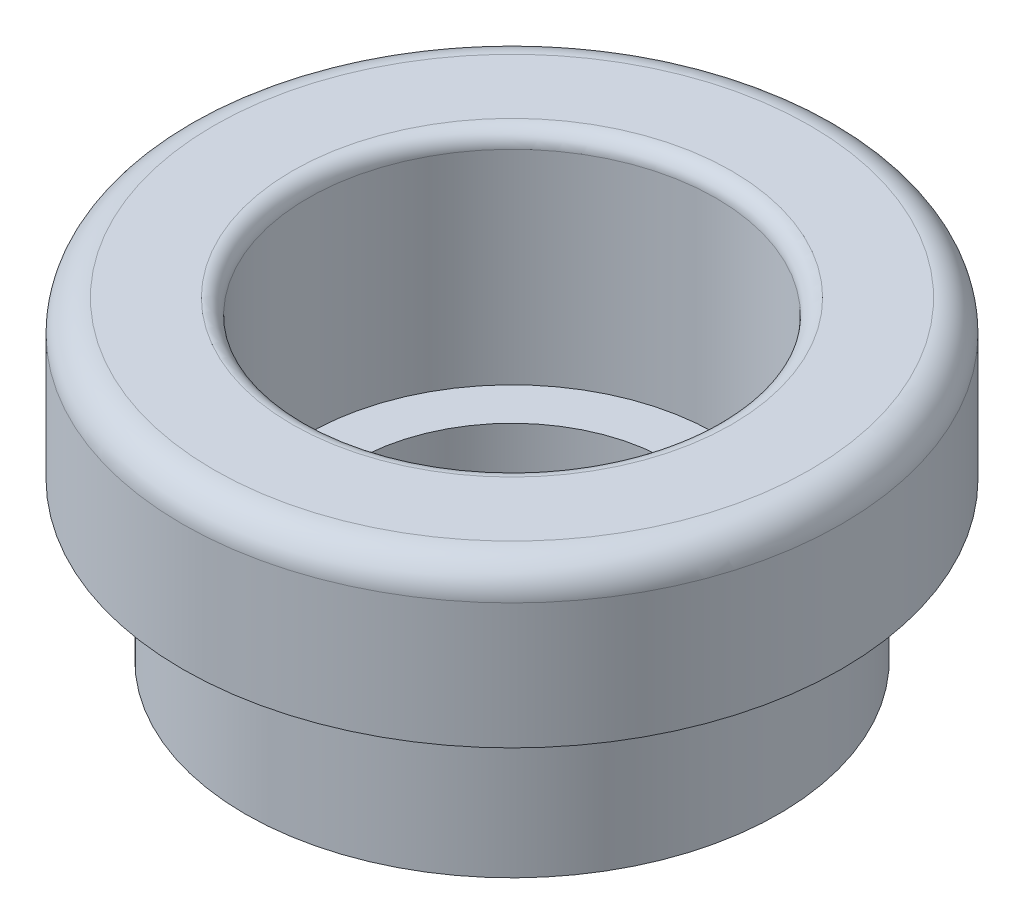
ISO-10303-21;
HEADER;
FILE_DESCRIPTION(('STEP AP214'),'2;1');
FILE_NAME('part.step','',(''),(''),'','','');
FILE_SCHEMA(('AUTOMOTIVE_DESIGN { 1 0 10303 214 1 1 1 1 }'));
ENDSEC;
DATA;
#1=APPLICATION_CONTEXT('core data for automotive mechanical design processes');
#2=APPLICATION_PROTOCOL_DEFINITION('international standard','automotive_design',2000,#1);
#3=PRODUCT_CONTEXT('',#1,'mechanical');
#4=PRODUCT('Part','Part','',(#3));
#5=PRODUCT_RELATED_PRODUCT_CATEGORY('part','',(#4));
#6=PRODUCT_DEFINITION_FORMATION('','',#4);
#7=PRODUCT_DEFINITION_CONTEXT('part definition',#1,'design');
#8=PRODUCT_DEFINITION('design','',#6,#7);
#9=PRODUCT_DEFINITION_SHAPE('','',#8);
#10=(LENGTH_UNIT() NAMED_UNIT(*) SI_UNIT(.MILLI.,.METRE.));
#11=(NAMED_UNIT(*) PLANE_ANGLE_UNIT() SI_UNIT($,.RADIAN.));
#12=(NAMED_UNIT(*) SI_UNIT($,.STERADIAN.) SOLID_ANGLE_UNIT());
#13=UNCERTAINTY_MEASURE_WITH_UNIT(LENGTH_MEASURE(1.E-05),#10,'distance_accuracy_value','');
#14=(GEOMETRIC_REPRESENTATION_CONTEXT(3) GLOBAL_UNCERTAINTY_ASSIGNED_CONTEXT((#13)) GLOBAL_UNIT_ASSIGNED_CONTEXT((#10,
#11,#12)) REPRESENTATION_CONTEXT('',''));
#15=CARTESIAN_POINT('',(0.,0.,0.));
#16=DIRECTION('',(0.,0.,1.));
#17=DIRECTION('',(1.,0.,0.));
#18=AXIS2_PLACEMENT_3D('',#15,#16,#17);
#19=CARTESIAN_POINT('',(0.,0.,0.));
#20=DIRECTION('',(0.,1.,0.));
#21=DIRECTION('',(0.,0.,1.));
#22=AXIS2_PLACEMENT_3D('',#19,#20,#21);
#23=CYLINDRICAL_SURFACE('',#22,5.);
#24=CARTESIAN_POINT('',(0.,0.,0.));
#25=DIRECTION('',(0.,1.,0.));
#26=DIRECTION('',(0.,0.,1.));
#27=AXIS2_PLACEMENT_3D('',#24,#25,#26);
#28=CIRCLE('',#27,5.);
#29=CARTESIAN_POINT('',(0.,0.,5.));
#30=VERTEX_POINT('',#29);
#31=EDGE_CURVE('E63',#30,#30,#28,.T.);
#32=ORIENTED_EDGE('',*,*,#31,.F.);
#33=EDGE_LOOP('',(#32));
#34=FACE_BOUND('',#33,.T.);
#35=CARTESIAN_POINT('',(0.,3.,0.));
#36=DIRECTION('',(0.,1.,0.));
#37=DIRECTION('',(0.,0.,1.));
#38=AXIS2_PLACEMENT_3D('',#35,#36,#37);
#39=CIRCLE('',#38,5.);
#40=CARTESIAN_POINT('',(0.,3.,5.));
#41=VERTEX_POINT('',#40);
#42=EDGE_CURVE('E60',#41,#41,#39,.F.);
#43=ORIENTED_EDGE('',*,*,#42,.F.);
#44=EDGE_LOOP('',(#43));
#45=FACE_BOUND('',#44,.T.);
#46=ADVANCED_FACE('F39',(#34,#45),#23,.F.);
#47=CARTESIAN_POINT('',(0.,5.,0.));
#48=DIRECTION('',(0.,-1.,0.));
#49=DIRECTION('',(0.,0.,-1.));
#50=AXIS2_PLACEMENT_3D('',#47,#48,#49);
#51=CYLINDRICAL_SURFACE('',#50,8.5);
#52=CARTESIAN_POINT('',(0.,5.,0.));
#53=DIRECTION('',(0.,1.,0.));
#54=DIRECTION('',(0.,0.,1.));
#55=AXIS2_PLACEMENT_3D('',#52,#53,#54);
#56=CIRCLE('',#55,8.5);
#57=CARTESIAN_POINT('',(0.,5.,8.5));
#58=VERTEX_POINT('',#57);
#59=EDGE_CURVE('E59',#58,#58,#56,.T.);
#60=ORIENTED_EDGE('',*,*,#59,.F.);
#61=EDGE_LOOP('',(#60));
#62=FACE_BOUND('',#61,.T.);
#63=CARTESIAN_POINT('',(0.,0.,0.));
#64=DIRECTION('',(0.,1.,0.));
#65=DIRECTION('',(0.,0.,1.));
#66=AXIS2_PLACEMENT_3D('',#63,#64,#65);
#67=CIRCLE('',#66,8.5);
#68=CARTESIAN_POINT('',(0.,0.,8.5));
#69=VERTEX_POINT('',#68);
#70=EDGE_CURVE('E65',#69,#69,#67,.T.);
#71=ORIENTED_EDGE('',*,*,#70,.T.);
#72=EDGE_LOOP('',(#71));
#73=FACE_BOUND('',#72,.T.);
#74=ADVANCED_FACE('F96',(#62,#73),#51,.T.);
#75=CARTESIAN_POINT('',(0.,0.,0.));
#76=DIRECTION('',(0.,1.,0.));
#77=DIRECTION('',(0.,0.,1.));
#78=AXIS2_PLACEMENT_3D('',#75,#76,#77);
#79=PLANE('',#78);
#80=ORIENTED_EDGE('',*,*,#31,.T.);
#81=EDGE_LOOP('',(#80));
#82=FACE_BOUND('',#81,.T.);
#83=ORIENTED_EDGE('',*,*,#70,.F.);
#84=EDGE_LOOP('',(#83));
#85=FACE_BOUND('',#84,.T.);
#86=ADVANCED_FACE('F102',(#82,#85),#79,.F.);
#87=CARTESIAN_POINT('',(0.,10.,0.));
#88=DIRECTION('',(0.,-1.,0.));
#89=DIRECTION('',(0.,0.,-1.));
#90=AXIS2_PLACEMENT_3D('',#87,#88,#89);
#91=CYLINDRICAL_SURFACE('',#90,10.5);
#92=CARTESIAN_POINT('',(0.,9.,0.));
#93=DIRECTION('',(0.,1.,0.));
#94=DIRECTION('',(0.,0.,1.));
#95=AXIS2_PLACEMENT_3D('',#92,#93,#94);
#96=CIRCLE('',#95,10.5);
#97=CARTESIAN_POINT('',(0.,9.,10.5));
#98=VERTEX_POINT('',#97);
#99=EDGE_CURVE('E50',#98,#98,#96,.F.);
#100=ORIENTED_EDGE('',*,*,#99,.T.);
#101=EDGE_LOOP('',(#100));
#102=FACE_BOUND('',#101,.T.);
#103=CARTESIAN_POINT('',(0.,5.,0.));
#104=DIRECTION('',(0.,1.,0.));
#105=DIRECTION('',(0.,0.,1.));
#106=AXIS2_PLACEMENT_3D('',#103,#104,#105);
#107=CIRCLE('',#106,10.5);
#108=CARTESIAN_POINT('',(0.,5.,10.5));
#109=VERTEX_POINT('',#108);
#110=EDGE_CURVE('E68',#109,#109,#107,.T.);
#111=ORIENTED_EDGE('',*,*,#110,.T.);
#112=EDGE_LOOP('',(#111));
#113=FACE_BOUND('',#112,.T.);
#114=ADVANCED_FACE('F110',(#102,#113),#91,.T.);
#115=CARTESIAN_POINT('',(0.,10.,0.));
#116=DIRECTION('',(0.,1.,0.));
#117=DIRECTION('',(0.,0.,1.));
#118=AXIS2_PLACEMENT_3D('',#115,#116,#117);
#119=PLANE('',#118);
#120=CARTESIAN_POINT('',(0.,10.,0.));
#121=DIRECTION('',(0.,1.,0.));
#122=DIRECTION('',(0.,0.,1.));
#123=AXIS2_PLACEMENT_3D('',#120,#121,#122);
#124=CIRCLE('',#123,7.);
#125=CARTESIAN_POINT('',(0.,10.,7.));
#126=VERTEX_POINT('',#125);
#127=EDGE_CURVE('E10',#126,#126,#124,.F.);
#128=ORIENTED_EDGE('',*,*,#127,.T.);
#129=EDGE_LOOP('',(#128));
#130=FACE_BOUND('',#129,.T.);
#131=CARTESIAN_POINT('',(0.,10.,0.));
#132=DIRECTION('',(0.,1.,0.));
#133=DIRECTION('',(0.,0.,1.));
#134=AXIS2_PLACEMENT_3D('',#131,#132,#133);
#135=CIRCLE('',#134,9.5);
#136=CARTESIAN_POINT('',(0.,10.,9.5));
#137=VERTEX_POINT('',#136);
#138=EDGE_CURVE('E54',#137,#137,#135,.T.);
#139=ORIENTED_EDGE('',*,*,#138,.T.);
#140=EDGE_LOOP('',(#139));
#141=FACE_BOUND('',#140,.T.);
#142=ADVANCED_FACE('F108',(#130,#141),#119,.T.);
#143=CARTESIAN_POINT('',(0.,5.,0.));
#144=DIRECTION('',(0.,1.,0.));
#145=DIRECTION('',(0.,0.,1.));
#146=AXIS2_PLACEMENT_3D('',#143,#144,#145);
#147=PLANE('',#146);
#148=ORIENTED_EDGE('',*,*,#59,.T.);
#149=EDGE_LOOP('',(#148));
#150=FACE_BOUND('',#149,.T.);
#151=ORIENTED_EDGE('',*,*,#110,.F.);
#152=EDGE_LOOP('',(#151));
#153=FACE_BOUND('',#152,.T.);
#154=ADVANCED_FACE('F92',(#150,#153),#147,.F.);
#155=CARTESIAN_POINT('',(0.,3.,0.));
#156=DIRECTION('',(0.,1.,0.));
#157=DIRECTION('',(0.,0.,1.));
#158=AXIS2_PLACEMENT_3D('',#155,#156,#157);
#159=PLANE('',#158);
#160=CARTESIAN_POINT('',(0.,3.,0.));
#161=DIRECTION('',(0.,1.,0.));
#162=DIRECTION('',(0.,0.,1.));
#163=AXIS2_PLACEMENT_3D('',#160,#161,#162);
#164=CIRCLE('',#163,6.5);
#165=CARTESIAN_POINT('',(0.,3.,6.5));
#166=VERTEX_POINT('',#165);
#167=EDGE_CURVE('E64',#166,#166,#164,.T.);
#168=ORIENTED_EDGE('',*,*,#167,.T.);
#169=EDGE_LOOP('',(#168));
#170=FACE_BOUND('',#169,.T.);
#171=ORIENTED_EDGE('',*,*,#42,.T.);
#172=EDGE_LOOP('',(#171));
#173=FACE_BOUND('',#172,.T.);
#174=ADVANCED_FACE('F78',(#170,#173),#159,.T.);
#175=CARTESIAN_POINT('',(0.,3.,0.));
#176=DIRECTION('',(0.,1.,0.));
#177=DIRECTION('',(0.,0.,1.));
#178=AXIS2_PLACEMENT_3D('',#175,#176,#177);
#179=CYLINDRICAL_SURFACE('',#178,6.5);
#180=CARTESIAN_POINT('',(0.,9.5,0.));
#181=DIRECTION('',(0.,1.,0.));
#182=DIRECTION('',(0.,0.,1.));
#183=AXIS2_PLACEMENT_3D('',#180,#181,#182);
#184=CIRCLE('',#183,6.5);
#185=CARTESIAN_POINT('',(0.,9.5,6.5));
#186=VERTEX_POINT('',#185);
#187=EDGE_CURVE('E46',#186,#186,#184,.T.);
#188=ORIENTED_EDGE('',*,*,#187,.T.);
#189=EDGE_LOOP('',(#188));
#190=FACE_BOUND('',#189,.T.);
#191=ORIENTED_EDGE('',*,*,#167,.F.);
#192=EDGE_LOOP('',(#191));
#193=FACE_BOUND('',#192,.T.);
#194=ADVANCED_FACE('F81',(#190,#193),#179,.F.);
#195=CARTESIAN_POINT('',(0.,9.,0.));
#196=DIRECTION('',(0.,1.,0.));
#197=DIRECTION('',(0.,0.,1.));
#198=AXIS2_PLACEMENT_3D('',#195,#196,#197);
#199=TOROIDAL_SURFACE('',#198,9.5,1.);
#200=ORIENTED_EDGE('',*,*,#99,.F.);
#201=EDGE_LOOP('',(#200));
#202=FACE_BOUND('',#201,.T.);
#203=ORIENTED_EDGE('',*,*,#138,.F.);
#204=EDGE_LOOP('',(#203));
#205=FACE_BOUND('',#204,.T.);
#206=ADVANCED_FACE('F83',(#202,#205),#199,.T.);
#207=CARTESIAN_POINT('',(0.,9.5,0.));
#208=DIRECTION('',(0.,1.,0.));
#209=DIRECTION('',(0.,0.,1.));
#210=AXIS2_PLACEMENT_3D('',#207,#208,#209);
#211=TOROIDAL_SURFACE('',#210,7.,0.5);
#212=ORIENTED_EDGE('',*,*,#127,.F.);
#213=EDGE_LOOP('',(#212));
#214=FACE_BOUND('',#213,.T.);
#215=ORIENTED_EDGE('',*,*,#187,.F.);
#216=EDGE_LOOP('',(#215));
#217=FACE_BOUND('',#216,.T.);
#218=ADVANCED_FACE('F41',(#214,#217),#211,.T.);
#219=CLOSED_SHELL('',(#46,#74,#86,#114,#142,#154,#174,#194,#206,#218));
#220=MANIFOLD_SOLID_BREP('B2',#219);
#221=ADVANCED_BREP_SHAPE_REPRESENTATION('',(#18,#220),#14);
#222=SHAPE_DEFINITION_REPRESENTATION(#9,#221);
ENDSEC;
END-ISO-10303-21;
